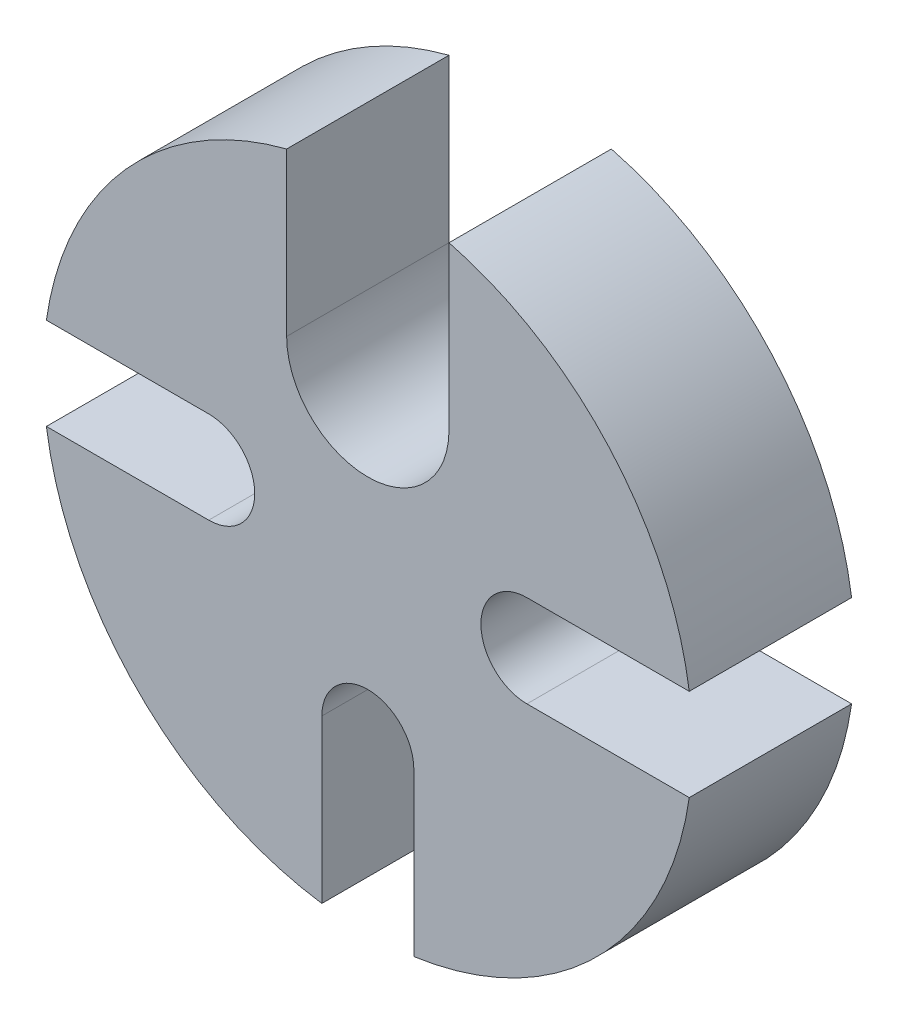
ISO-10303-21;
HEADER;
FILE_DESCRIPTION(('STEP AP214'),'2;1');
FILE_NAME('part.step','',(''),(''),'','','');
FILE_SCHEMA(('AUTOMOTIVE_DESIGN { 1 0 10303 214 1 1 1 1 }'));
ENDSEC;
DATA;
#1=APPLICATION_CONTEXT('core data for automotive mechanical design processes');
#2=APPLICATION_PROTOCOL_DEFINITION('international standard','automotive_design',2000,#1);
#3=PRODUCT_CONTEXT('',#1,'mechanical');
#4=PRODUCT('Part','Part','',(#3));
#5=PRODUCT_RELATED_PRODUCT_CATEGORY('part','',(#4));
#6=PRODUCT_DEFINITION_FORMATION('','',#4);
#7=PRODUCT_DEFINITION_CONTEXT('part definition',#1,'design');
#8=PRODUCT_DEFINITION('design','',#6,#7);
#9=PRODUCT_DEFINITION_SHAPE('','',#8);
#10=(LENGTH_UNIT() NAMED_UNIT(*) SI_UNIT(.MILLI.,.METRE.));
#11=(NAMED_UNIT(*) PLANE_ANGLE_UNIT() SI_UNIT($,.RADIAN.));
#12=(NAMED_UNIT(*) SI_UNIT($,.STERADIAN.) SOLID_ANGLE_UNIT());
#13=UNCERTAINTY_MEASURE_WITH_UNIT(LENGTH_MEASURE(1.E-05),#10,'distance_accuracy_value','');
#14=(GEOMETRIC_REPRESENTATION_CONTEXT(3) GLOBAL_UNCERTAINTY_ASSIGNED_CONTEXT((#13)) GLOBAL_UNIT_ASSIGNED_CONTEXT((#10,
#11,#12)) REPRESENTATION_CONTEXT('',''));
#15=CARTESIAN_POINT('',(0.,0.,0.));
#16=DIRECTION('',(0.,0.,1.));
#17=DIRECTION('',(1.,0.,0.));
#18=AXIS2_PLACEMENT_3D('',#15,#16,#17);
#19=CARTESIAN_POINT('',(0.,0.,0.));
#20=DIRECTION('',(0.,0.,1.));
#21=DIRECTION('',(1.,0.,0.));
#22=AXIS2_PLACEMENT_3D('',#19,#20,#21);
#23=CYLINDRICAL_SURFACE('',#22,1524.);
#24=DIRECTION('',(0.,0.,-1.));
#25=VECTOR('',#24,1.);
#26=CARTESIAN_POINT('',(-1508.62957348668,-215.9,762.));
#27=LINE('',#26,#25);
#28=CARTESIAN_POINT('',(-1508.62957348668,-215.9,762.));
#29=VERTEX_POINT('',#28);
#30=CARTESIAN_POINT('',(-1508.62957348668,-215.9,0.));
#31=VERTEX_POINT('',#30);
#32=EDGE_CURVE('E196',#29,#31,#27,.T.);
#33=ORIENTED_EDGE('',*,*,#32,.T.);
#34=CARTESIAN_POINT('',(0.,0.,0.));
#35=DIRECTION('',(0.,0.,1.));
#36=DIRECTION('',(1.,0.,0.));
#37=AXIS2_PLACEMENT_3D('',#34,#35,#36);
#38=CIRCLE('',#37,1524.);
#39=CARTESIAN_POINT('',(-215.9,-1508.62957348668,0.));
#40=VERTEX_POINT('',#39);
#41=EDGE_CURVE('E180',#31,#40,#38,.T.);
#42=ORIENTED_EDGE('',*,*,#41,.T.);
#43=DIRECTION('',(0.,0.,-1.));
#44=VECTOR('',#43,1.);
#45=CARTESIAN_POINT('',(-215.9,-1508.62957348668,762.));
#46=LINE('',#45,#44);
#47=CARTESIAN_POINT('',(-215.9,-1508.62957348668,762.));
#48=VERTEX_POINT('',#47);
#49=EDGE_CURVE('E181',#48,#40,#46,.T.);
#50=ORIENTED_EDGE('',*,*,#49,.F.);
#51=CARTESIAN_POINT('',(0.,0.,762.));
#52=DIRECTION('',(0.,0.,1.));
#53=DIRECTION('',(1.,0.,0.));
#54=AXIS2_PLACEMENT_3D('',#51,#52,#53);
#55=CIRCLE('',#54,1524.);
#56=EDGE_CURVE('E173',#29,#48,#55,.T.);
#57=ORIENTED_EDGE('',*,*,#56,.F.);
#58=EDGE_LOOP('',(#33,#42,#50,#57));
#59=FACE_BOUND('',#58,.T.);
#60=ADVANCED_FACE('F34',(#59),#23,.T.);
#61=DIRECTION('',(0.,0.,-1.));
#62=VECTOR('',#61,1.);
#63=CARTESIAN_POINT('',(-1508.62957348668,215.9,762.));
#64=LINE('',#63,#62);
#65=CARTESIAN_POINT('',(-1508.62957348668,215.9,762.));
#66=VERTEX_POINT('',#65);
#67=CARTESIAN_POINT('',(-1508.62957348668,215.9,0.));
#68=VERTEX_POINT('',#67);
#69=EDGE_CURVE('E150',#66,#68,#64,.T.);
#70=ORIENTED_EDGE('',*,*,#69,.F.);
#71=CARTESIAN_POINT('',(-381.,1475.60665490458,762.));
#72=VERTEX_POINT('',#71);
#73=EDGE_CURVE('E162',#72,#66,#55,.T.);
#74=ORIENTED_EDGE('',*,*,#73,.F.);
#75=DIRECTION('',(0.,0.,-1.));
#76=VECTOR('',#75,1.);
#77=CARTESIAN_POINT('',(-381.,1475.60665490458,762.));
#78=LINE('',#77,#76);
#79=CARTESIAN_POINT('',(-381.,1475.60665490458,0.));
#80=VERTEX_POINT('',#79);
#81=EDGE_CURVE('E250',#72,#80,#78,.T.);
#82=ORIENTED_EDGE('',*,*,#81,.T.);
#83=EDGE_CURVE('E164',#80,#68,#38,.T.);
#84=ORIENTED_EDGE('',*,*,#83,.T.);
#85=EDGE_LOOP('',(#70,#74,#82,#84));
#86=FACE_BOUND('',#85,.T.);
#87=ADVANCED_FACE('F160',(#86),#23,.T.);
#88=DIRECTION('',(0.,0.,-1.));
#89=VECTOR('',#88,1.);
#90=CARTESIAN_POINT('',(381.,1475.60665490455,762.));
#91=LINE('',#90,#89);
#92=CARTESIAN_POINT('',(381.,1475.60665490455,762.));
#93=VERTEX_POINT('',#92);
#94=CARTESIAN_POINT('',(381.,1475.60665490455,0.));
#95=VERTEX_POINT('',#94);
#96=EDGE_CURVE('E258',#93,#95,#91,.T.);
#97=ORIENTED_EDGE('',*,*,#96,.F.);
#98=CARTESIAN_POINT('',(1508.62957348668,215.9,762.));
#99=VERTEX_POINT('',#98);
#100=EDGE_CURVE('E172',#99,#93,#55,.T.);
#101=ORIENTED_EDGE('',*,*,#100,.F.);
#102=DIRECTION('',(0.,0.,-1.));
#103=VECTOR('',#102,1.);
#104=CARTESIAN_POINT('',(1508.62957348668,215.9,762.));
#105=LINE('',#104,#103);
#106=CARTESIAN_POINT('',(1508.62957348668,215.9,0.));
#107=VERTEX_POINT('',#106);
#108=EDGE_CURVE('E215',#99,#107,#105,.T.);
#109=ORIENTED_EDGE('',*,*,#108,.T.);
#110=EDGE_CURVE('E184',#107,#95,#38,.T.);
#111=ORIENTED_EDGE('',*,*,#110,.T.);
#112=EDGE_LOOP('',(#97,#101,#109,#111));
#113=FACE_BOUND('',#112,.T.);
#114=ADVANCED_FACE('F312',(#113),#23,.T.);
#115=DIRECTION('',(0.,0.,-1.));
#116=VECTOR('',#115,1.);
#117=CARTESIAN_POINT('',(1508.62957348668,-215.9,762.));
#118=LINE('',#117,#116);
#119=CARTESIAN_POINT('',(1508.62957348668,-215.9,762.));
#120=VERTEX_POINT('',#119);
#121=CARTESIAN_POINT('',(1508.62957348668,-215.9,0.));
#122=VERTEX_POINT('',#121);
#123=EDGE_CURVE('E235',#120,#122,#118,.T.);
#124=ORIENTED_EDGE('',*,*,#123,.F.);
#125=CARTESIAN_POINT('',(215.9,-1508.62957348668,762.));
#126=VERTEX_POINT('',#125);
#127=EDGE_CURVE('E176',#126,#120,#55,.T.);
#128=ORIENTED_EDGE('',*,*,#127,.F.);
#129=DIRECTION('',(0.,0.,-1.));
#130=VECTOR('',#129,1.);
#131=CARTESIAN_POINT('',(215.9,-1508.62957348668,762.));
#132=LINE('',#131,#130);
#133=CARTESIAN_POINT('',(215.9,-1508.62957348668,0.));
#134=VERTEX_POINT('',#133);
#135=EDGE_CURVE('E177',#126,#134,#132,.T.);
#136=ORIENTED_EDGE('',*,*,#135,.T.);
#137=EDGE_CURVE('E42',#134,#122,#38,.T.);
#138=ORIENTED_EDGE('',*,*,#137,.T.);
#139=EDGE_LOOP('',(#124,#128,#136,#138));
#140=FACE_BOUND('',#139,.T.);
#141=ADVANCED_FACE('F36',(#140),#23,.T.);
#142=CARTESIAN_POINT('',(1524.,0.,0.));
#143=DIRECTION('',(0.,0.,-1.));
#144=DIRECTION('',(-1.,0.,0.));
#145=AXIS2_PLACEMENT_3D('',#142,#143,#144);
#146=PLANE('',#145);
#147=CARTESIAN_POINT('',(0.,0.,0.));
#148=DIRECTION('',(0.,0.,-1.));
#149=DIRECTION('',(-1.,0.,0.));
#150=AXIS2_PLACEMENT_3D('',#147,#148,#149);
#151=CIRCLE('',#150,50.8);
#152=CARTESIAN_POINT('',(-50.8,0.,0.));
#153=VERTEX_POINT('',#152);
#154=EDGE_CURVE('E11',#153,#153,#151,.T.);
#155=ORIENTED_EDGE('',*,*,#154,.F.);
#156=EDGE_LOOP('',(#155));
#157=FACE_BOUND('',#156,.T.);
#158=DIRECTION('',(-1.,0.,0.));
#159=VECTOR('',#158,1.);
#160=CARTESIAN_POINT('',(-746.75999999954,-215.9,0.));
#161=LINE('',#160,#159);
#162=CARTESIAN_POINT('',(-746.75999999954,-215.9,0.));
#163=VERTEX_POINT('',#162);
#164=EDGE_CURVE('E155',#163,#31,#161,.T.);
#165=ORIENTED_EDGE('',*,*,#164,.F.);
#166=CARTESIAN_POINT('',(-746.75999999954,0.,0.));
#167=DIRECTION('',(0.,0.,-1.));
#168=DIRECTION('',(-1.,0.,0.));
#169=AXIS2_PLACEMENT_3D('',#166,#167,#168);
#170=CIRCLE('',#169,215.9);
#171=CARTESIAN_POINT('',(-746.75999999954,215.9,0.));
#172=VERTEX_POINT('',#171);
#173=EDGE_CURVE('E283',#172,#163,#170,.T.);
#174=ORIENTED_EDGE('',*,*,#173,.F.);
#175=DIRECTION('',(1.,0.,0.));
#176=VECTOR('',#175,1.);
#177=CARTESIAN_POINT('',(-1508.62957348668,215.9,0.));
#178=LINE('',#177,#176);
#179=EDGE_CURVE('E286',#68,#172,#178,.T.);
#180=ORIENTED_EDGE('',*,*,#179,.F.);
#181=ORIENTED_EDGE('',*,*,#83,.F.);
#182=DIRECTION('',(0.,1.,0.));
#183=VECTOR('',#182,1.);
#184=CARTESIAN_POINT('',(-381.,713.739999999095,0.));
#185=LINE('',#184,#183);
#186=CARTESIAN_POINT('',(-381.,713.739999999095,0.));
#187=VERTEX_POINT('',#186);
#188=EDGE_CURVE('E265',#187,#80,#185,.T.);
#189=ORIENTED_EDGE('',*,*,#188,.F.);
#190=CARTESIAN_POINT('',(-1.11022302462516E-13,713.739999999095,0.));
#191=DIRECTION('',(0.,0.,-1.));
#192=DIRECTION('',(-1.,0.,0.));
#193=AXIS2_PLACEMENT_3D('',#190,#191,#192);
#194=CIRCLE('',#193,381.);
#195=CARTESIAN_POINT('',(381.,713.739999999095,0.));
#196=VERTEX_POINT('',#195);
#197=EDGE_CURVE('E268',#196,#187,#194,.T.);
#198=ORIENTED_EDGE('',*,*,#197,.F.);
#199=DIRECTION('',(0.,-1.,0.));
#200=VECTOR('',#199,1.);
#201=CARTESIAN_POINT('',(381.,1475.60665490455,0.));
#202=LINE('',#201,#200);
#203=EDGE_CURVE('E271',#95,#196,#202,.T.);
#204=ORIENTED_EDGE('',*,*,#203,.F.);
#205=ORIENTED_EDGE('',*,*,#110,.F.);
#206=DIRECTION('',(1.,0.,0.));
#207=VECTOR('',#206,1.);
#208=CARTESIAN_POINT('',(746.75999999954,215.9,0.));
#209=LINE('',#208,#207);
#210=CARTESIAN_POINT('',(746.75999999954,215.9,0.));
#211=VERTEX_POINT('',#210);
#212=EDGE_CURVE('E241',#211,#107,#209,.T.);
#213=ORIENTED_EDGE('',*,*,#212,.F.);
#214=CARTESIAN_POINT('',(746.75999999954,0.,0.));
#215=DIRECTION('',(0.,0.,-1.));
#216=DIRECTION('',(-1.,0.,0.));
#217=AXIS2_PLACEMENT_3D('',#214,#215,#216);
#218=CIRCLE('',#217,215.9);
#219=CARTESIAN_POINT('',(746.75999999954,-215.9,0.));
#220=VERTEX_POINT('',#219);
#221=EDGE_CURVE('E244',#220,#211,#218,.T.);
#222=ORIENTED_EDGE('',*,*,#221,.F.);
#223=DIRECTION('',(-1.,0.,0.));
#224=VECTOR('',#223,1.);
#225=CARTESIAN_POINT('',(1508.62957348668,-215.9,0.));
#226=LINE('',#225,#224);
#227=EDGE_CURVE('E247',#122,#220,#226,.T.);
#228=ORIENTED_EDGE('',*,*,#227,.F.);
#229=ORIENTED_EDGE('',*,*,#137,.F.);
#230=DIRECTION('',(0.,-1.,0.));
#231=VECTOR('',#230,1.);
#232=CARTESIAN_POINT('',(215.9,-746.75999999954,0.));
#233=LINE('',#232,#231);
#234=CARTESIAN_POINT('',(215.9,-746.75999999954,0.));
#235=VERTEX_POINT('',#234);
#236=EDGE_CURVE('E217',#235,#134,#233,.T.);
#237=ORIENTED_EDGE('',*,*,#236,.F.);
#238=CARTESIAN_POINT('',(0.,-746.75999999954,0.));
#239=DIRECTION('',(0.,0.,-1.));
#240=DIRECTION('',(-1.,0.,0.));
#241=AXIS2_PLACEMENT_3D('',#238,#239,#240);
#242=CIRCLE('',#241,215.9);
#243=CARTESIAN_POINT('',(-215.9,-746.75999999954,0.));
#244=VERTEX_POINT('',#243);
#245=EDGE_CURVE('E214',#244,#235,#242,.T.);
#246=ORIENTED_EDGE('',*,*,#245,.F.);
#247=DIRECTION('',(0.,1.,0.));
#248=VECTOR('',#247,1.);
#249=CARTESIAN_POINT('',(-215.9,-1508.62957348668,0.));
#250=LINE('',#249,#248);
#251=EDGE_CURVE('E205',#40,#244,#250,.T.);
#252=ORIENTED_EDGE('',*,*,#251,.F.);
#253=ORIENTED_EDGE('',*,*,#41,.F.);
#254=EDGE_LOOP('',(#165,#174,#180,#181,#189,#198,#204,#205,#213,#222,#228,#229,#237,#246,#252,#253));
#255=FACE_BOUND('',#254,.T.);
#256=ADVANCED_FACE('F211',(#157,#255),#146,.T.);
#257=CARTESIAN_POINT('',(0.,0.,762.));
#258=DIRECTION('',(0.,0.,1.));
#259=DIRECTION('',(1.,0.,0.));
#260=AXIS2_PLACEMENT_3D('',#257,#258,#259);
#261=PLANE('',#260);
#262=DIRECTION('',(-1.,0.,0.));
#263=VECTOR('',#262,1.);
#264=CARTESIAN_POINT('',(-746.75999999954,-215.9,762.));
#265=LINE('',#264,#263);
#266=CARTESIAN_POINT('',(-746.75999999954,-215.9,762.));
#267=VERTEX_POINT('',#266);
#268=EDGE_CURVE('E165',#267,#29,#265,.T.);
#269=ORIENTED_EDGE('',*,*,#268,.T.);
#270=ORIENTED_EDGE('',*,*,#56,.T.);
#271=DIRECTION('',(0.,1.,0.));
#272=VECTOR('',#271,1.);
#273=CARTESIAN_POINT('',(-215.9,-1508.62957348668,762.));
#274=LINE('',#273,#272);
#275=CARTESIAN_POINT('',(-215.9,-746.75999999954,762.));
#276=VERTEX_POINT('',#275);
#277=EDGE_CURVE('E208',#48,#276,#274,.T.);
#278=ORIENTED_EDGE('',*,*,#277,.T.);
#279=CARTESIAN_POINT('',(0.,-746.75999999954,762.));
#280=DIRECTION('',(0.,0.,-1.));
#281=DIRECTION('',(-1.,0.,0.));
#282=AXIS2_PLACEMENT_3D('',#279,#280,#281);
#283=CIRCLE('',#282,215.9);
#284=CARTESIAN_POINT('',(215.9,-746.75999999954,762.));
#285=VERTEX_POINT('',#284);
#286=EDGE_CURVE('E231',#276,#285,#283,.T.);
#287=ORIENTED_EDGE('',*,*,#286,.T.);
#288=DIRECTION('',(0.,-1.,0.));
#289=VECTOR('',#288,1.);
#290=CARTESIAN_POINT('',(215.9,-746.75999999954,762.));
#291=LINE('',#290,#289);
#292=EDGE_CURVE('E210',#285,#126,#291,.T.);
#293=ORIENTED_EDGE('',*,*,#292,.T.);
#294=ORIENTED_EDGE('',*,*,#127,.T.);
#295=DIRECTION('',(-1.,0.,0.));
#296=VECTOR('',#295,1.);
#297=CARTESIAN_POINT('',(1508.62957348668,-215.9,762.));
#298=LINE('',#297,#296);
#299=CARTESIAN_POINT('',(746.75999999954,-215.9,762.));
#300=VERTEX_POINT('',#299);
#301=EDGE_CURVE('E243',#120,#300,#298,.T.);
#302=ORIENTED_EDGE('',*,*,#301,.T.);
#303=CARTESIAN_POINT('',(746.75999999954,0.,762.));
#304=DIRECTION('',(0.,0.,-1.));
#305=DIRECTION('',(-1.,0.,0.));
#306=AXIS2_PLACEMENT_3D('',#303,#304,#305);
#307=CIRCLE('',#306,215.9);
#308=CARTESIAN_POINT('',(746.75999999954,215.9,762.));
#309=VERTEX_POINT('',#308);
#310=EDGE_CURVE('E253',#300,#309,#307,.T.);
#311=ORIENTED_EDGE('',*,*,#310,.T.);
#312=DIRECTION('',(1.,0.,0.));
#313=VECTOR('',#312,1.);
#314=CARTESIAN_POINT('',(746.75999999954,215.9,762.));
#315=LINE('',#314,#313);
#316=EDGE_CURVE('E238',#309,#99,#315,.T.);
#317=ORIENTED_EDGE('',*,*,#316,.T.);
#318=ORIENTED_EDGE('',*,*,#100,.T.);
#319=DIRECTION('',(0.,-1.,0.));
#320=VECTOR('',#319,1.);
#321=CARTESIAN_POINT('',(381.,1475.60665490455,762.));
#322=LINE('',#321,#320);
#323=CARTESIAN_POINT('',(381.,713.739999999095,762.));
#324=VERTEX_POINT('',#323);
#325=EDGE_CURVE('E267',#93,#324,#322,.T.);
#326=ORIENTED_EDGE('',*,*,#325,.T.);
#327=CARTESIAN_POINT('',(-1.11022302462516E-13,713.739999999095,762.));
#328=DIRECTION('',(0.,0.,-1.));
#329=DIRECTION('',(-1.,0.,0.));
#330=AXIS2_PLACEMENT_3D('',#327,#328,#329);
#331=CIRCLE('',#330,381.);
#332=CARTESIAN_POINT('',(-381.,713.739999999095,762.));
#333=VERTEX_POINT('',#332);
#334=EDGE_CURVE('E57',#324,#333,#331,.T.);
#335=ORIENTED_EDGE('',*,*,#334,.T.);
#336=DIRECTION('',(0.,1.,0.));
#337=VECTOR('',#336,1.);
#338=CARTESIAN_POINT('',(-381.,713.739999999095,762.));
#339=LINE('',#338,#337);
#340=EDGE_CURVE('E171',#333,#72,#339,.T.);
#341=ORIENTED_EDGE('',*,*,#340,.T.);
#342=ORIENTED_EDGE('',*,*,#73,.T.);
#343=DIRECTION('',(1.,0.,0.));
#344=VECTOR('',#343,1.);
#345=CARTESIAN_POINT('',(-1508.62957348668,215.9,762.));
#346=LINE('',#345,#344);
#347=CARTESIAN_POINT('',(-746.75999999954,215.9,762.));
#348=VERTEX_POINT('',#347);
#349=EDGE_CURVE('E146',#66,#348,#346,.T.);
#350=ORIENTED_EDGE('',*,*,#349,.T.);
#351=CARTESIAN_POINT('',(-746.75999999954,0.,762.));
#352=DIRECTION('',(0.,0.,-1.));
#353=DIRECTION('',(-1.,0.,0.));
#354=AXIS2_PLACEMENT_3D('',#351,#352,#353);
#355=CIRCLE('',#354,215.9);
#356=EDGE_CURVE('E49',#348,#267,#355,.T.);
#357=ORIENTED_EDGE('',*,*,#356,.T.);
#358=EDGE_LOOP('',(#269,#270,#278,#287,#293,#294,#302,#311,#317,#318,#326,#335,#341,#342,#350,#357));
#359=FACE_BOUND('',#358,.T.);
#360=ADVANCED_FACE('F169',(#359),#261,.T.);
#361=CARTESIAN_POINT('',(215.9,-746.75999999954,762.));
#362=DIRECTION('',(1.,0.,0.));
#363=DIRECTION('',(0.,1.,0.));
#364=AXIS2_PLACEMENT_3D('',#361,#362,#363);
#365=PLANE('',#364);
#366=ORIENTED_EDGE('',*,*,#236,.T.);
#367=ORIENTED_EDGE('',*,*,#135,.F.);
#368=ORIENTED_EDGE('',*,*,#292,.F.);
#369=DIRECTION('',(0.,0.,-1.));
#370=VECTOR('',#369,1.);
#371=CARTESIAN_POINT('',(215.9,-746.75999999954,762.));
#372=LINE('',#371,#370);
#373=EDGE_CURVE('E227',#285,#235,#372,.T.);
#374=ORIENTED_EDGE('',*,*,#373,.T.);
#375=EDGE_LOOP('',(#366,#367,#368,#374));
#376=FACE_BOUND('',#375,.T.);
#377=ADVANCED_FACE('F325',(#376),#365,.F.);
#378=CARTESIAN_POINT('',(0.,-746.75999999954,762.));
#379=DIRECTION('',(0.,0.,-1.));
#380=DIRECTION('',(-1.,0.,0.));
#381=AXIS2_PLACEMENT_3D('',#378,#379,#380);
#382=CYLINDRICAL_SURFACE('',#381,215.9);
#383=ORIENTED_EDGE('',*,*,#245,.T.);
#384=ORIENTED_EDGE('',*,*,#373,.F.);
#385=ORIENTED_EDGE('',*,*,#286,.F.);
#386=DIRECTION('',(0.,0.,-1.));
#387=VECTOR('',#386,1.);
#388=CARTESIAN_POINT('',(-215.9,-746.75999999954,762.));
#389=LINE('',#388,#387);
#390=EDGE_CURVE('E209',#276,#244,#389,.T.);
#391=ORIENTED_EDGE('',*,*,#390,.T.);
#392=EDGE_LOOP('',(#383,#384,#385,#391));
#393=FACE_BOUND('',#392,.T.);
#394=ADVANCED_FACE('F229',(#393),#382,.F.);
#395=CARTESIAN_POINT('',(-215.9,-1508.62957348668,762.));
#396=DIRECTION('',(-1.,0.,0.));
#397=DIRECTION('',(0.,-1.,0.));
#398=AXIS2_PLACEMENT_3D('',#395,#396,#397);
#399=PLANE('',#398);
#400=ORIENTED_EDGE('',*,*,#251,.T.);
#401=ORIENTED_EDGE('',*,*,#390,.F.);
#402=ORIENTED_EDGE('',*,*,#277,.F.);
#403=ORIENTED_EDGE('',*,*,#49,.T.);
#404=EDGE_LOOP('',(#400,#401,#402,#403));
#405=FACE_BOUND('',#404,.T.);
#406=ADVANCED_FACE('F203',(#405),#399,.F.);
#407=CARTESIAN_POINT('',(746.75999999954,215.9,762.));
#408=DIRECTION('',(0.,1.,0.));
#409=DIRECTION('',(0.,0.,1.));
#410=AXIS2_PLACEMENT_3D('',#407,#408,#409);
#411=PLANE('',#410);
#412=ORIENTED_EDGE('',*,*,#212,.T.);
#413=ORIENTED_EDGE('',*,*,#108,.F.);
#414=ORIENTED_EDGE('',*,*,#316,.F.);
#415=DIRECTION('',(0.,0.,-1.));
#416=VECTOR('',#415,1.);
#417=CARTESIAN_POINT('',(746.75999999954,215.9,762.));
#418=LINE('',#417,#416);
#419=EDGE_CURVE('E220',#309,#211,#418,.T.);
#420=ORIENTED_EDGE('',*,*,#419,.T.);
#421=EDGE_LOOP('',(#412,#413,#414,#420));
#422=FACE_BOUND('',#421,.T.);
#423=ADVANCED_FACE('F361',(#422),#411,.F.);
#424=CARTESIAN_POINT('',(746.75999999954,0.,762.));
#425=DIRECTION('',(0.,0.,-1.));
#426=DIRECTION('',(-1.,0.,0.));
#427=AXIS2_PLACEMENT_3D('',#424,#425,#426);
#428=CYLINDRICAL_SURFACE('',#427,215.9);
#429=ORIENTED_EDGE('',*,*,#221,.T.);
#430=ORIENTED_EDGE('',*,*,#419,.F.);
#431=ORIENTED_EDGE('',*,*,#310,.F.);
#432=DIRECTION('',(0.,0.,-1.));
#433=VECTOR('',#432,1.);
#434=CARTESIAN_POINT('',(746.75999999954,-215.9,762.));
#435=LINE('',#434,#433);
#436=EDGE_CURVE('E237',#300,#220,#435,.T.);
#437=ORIENTED_EDGE('',*,*,#436,.T.);
#438=EDGE_LOOP('',(#429,#430,#431,#437));
#439=FACE_BOUND('',#438,.T.);
#440=ADVANCED_FACE('F331',(#439),#428,.F.);
#441=CARTESIAN_POINT('',(1508.62957348668,-215.9,762.));
#442=DIRECTION('',(0.,-1.,0.));
#443=DIRECTION('',(0.,0.,-1.));
#444=AXIS2_PLACEMENT_3D('',#441,#442,#443);
#445=PLANE('',#444);
#446=ORIENTED_EDGE('',*,*,#227,.T.);
#447=ORIENTED_EDGE('',*,*,#436,.F.);
#448=ORIENTED_EDGE('',*,*,#301,.F.);
#449=ORIENTED_EDGE('',*,*,#123,.T.);
#450=EDGE_LOOP('',(#446,#447,#448,#449));
#451=FACE_BOUND('',#450,.T.);
#452=ADVANCED_FACE('F329',(#451),#445,.F.);
#453=CARTESIAN_POINT('',(-381.,713.739999999095,762.));
#454=DIRECTION('',(-1.,0.,0.));
#455=DIRECTION('',(0.,-1.,0.));
#456=AXIS2_PLACEMENT_3D('',#453,#454,#455);
#457=PLANE('',#456);
#458=ORIENTED_EDGE('',*,*,#188,.T.);
#459=ORIENTED_EDGE('',*,*,#81,.F.);
#460=ORIENTED_EDGE('',*,*,#340,.F.);
#461=DIRECTION('',(0.,0.,-1.));
#462=VECTOR('',#461,1.);
#463=CARTESIAN_POINT('',(-381.,713.739999999095,762.));
#464=LINE('',#463,#462);
#465=EDGE_CURVE('E262',#333,#187,#464,.T.);
#466=ORIENTED_EDGE('',*,*,#465,.T.);
#467=EDGE_LOOP('',(#458,#459,#460,#466));
#468=FACE_BOUND('',#467,.T.);
#469=ADVANCED_FACE('F344',(#468),#457,.F.);
#470=CARTESIAN_POINT('',(-1.11022302462516E-13,713.739999999095,762.));
#471=DIRECTION('',(0.,0.,-1.));
#472=DIRECTION('',(-1.,0.,0.));
#473=AXIS2_PLACEMENT_3D('',#470,#471,#472);
#474=CYLINDRICAL_SURFACE('',#473,381.);
#475=ORIENTED_EDGE('',*,*,#197,.T.);
#476=ORIENTED_EDGE('',*,*,#465,.F.);
#477=ORIENTED_EDGE('',*,*,#334,.F.);
#478=DIRECTION('',(0.,0.,-1.));
#479=VECTOR('',#478,1.);
#480=CARTESIAN_POINT('',(381.,713.739999999095,762.));
#481=LINE('',#480,#479);
#482=EDGE_CURVE('E260',#324,#196,#481,.T.);
#483=ORIENTED_EDGE('',*,*,#482,.T.);
#484=EDGE_LOOP('',(#475,#476,#477,#483));
#485=FACE_BOUND('',#484,.T.);
#486=ADVANCED_FACE('F342',(#485),#474,.F.);
#487=CARTESIAN_POINT('',(381.,1475.60665490455,762.));
#488=DIRECTION('',(1.,0.,0.));
#489=DIRECTION('',(0.,1.,0.));
#490=AXIS2_PLACEMENT_3D('',#487,#488,#489);
#491=PLANE('',#490);
#492=ORIENTED_EDGE('',*,*,#203,.T.);
#493=ORIENTED_EDGE('',*,*,#482,.F.);
#494=ORIENTED_EDGE('',*,*,#325,.F.);
#495=ORIENTED_EDGE('',*,*,#96,.T.);
#496=EDGE_LOOP('',(#492,#493,#494,#495));
#497=FACE_BOUND('',#496,.T.);
#498=ADVANCED_FACE('F339',(#497),#491,.F.);
#499=CARTESIAN_POINT('',(-746.75999999954,-215.9,762.));
#500=DIRECTION('',(0.,-1.,0.));
#501=DIRECTION('',(1.,0.,0.));
#502=AXIS2_PLACEMENT_3D('',#499,#500,#501);
#503=PLANE('',#502);
#504=ORIENTED_EDGE('',*,*,#164,.T.);
#505=ORIENTED_EDGE('',*,*,#32,.F.);
#506=ORIENTED_EDGE('',*,*,#268,.F.);
#507=DIRECTION('',(0.,0.,-1.));
#508=VECTOR('',#507,1.);
#509=CARTESIAN_POINT('',(-746.75999999954,-215.9,762.));
#510=LINE('',#509,#508);
#511=EDGE_CURVE('E279',#267,#163,#510,.T.);
#512=ORIENTED_EDGE('',*,*,#511,.T.);
#513=EDGE_LOOP('',(#504,#505,#506,#512));
#514=FACE_BOUND('',#513,.T.);
#515=ADVANCED_FACE('F348',(#514),#503,.F.);
#516=CARTESIAN_POINT('',(-746.75999999954,0.,762.));
#517=DIRECTION('',(0.,0.,-1.));
#518=DIRECTION('',(-1.,0.,0.));
#519=AXIS2_PLACEMENT_3D('',#516,#517,#518);
#520=CYLINDRICAL_SURFACE('',#519,215.9);
#521=ORIENTED_EDGE('',*,*,#173,.T.);
#522=ORIENTED_EDGE('',*,*,#511,.F.);
#523=ORIENTED_EDGE('',*,*,#356,.F.);
#524=DIRECTION('',(0.,0.,-1.));
#525=VECTOR('',#524,1.);
#526=CARTESIAN_POINT('',(-746.75999999954,215.9,762.));
#527=LINE('',#526,#525);
#528=EDGE_CURVE('E152',#348,#172,#527,.T.);
#529=ORIENTED_EDGE('',*,*,#528,.T.);
#530=EDGE_LOOP('',(#521,#522,#523,#529));
#531=FACE_BOUND('',#530,.T.);
#532=ADVANCED_FACE('F305',(#531),#520,.F.);
#533=CARTESIAN_POINT('',(-1508.62957348668,215.9,762.));
#534=DIRECTION('',(0.,1.,0.));
#535=DIRECTION('',(-1.,0.,0.));
#536=AXIS2_PLACEMENT_3D('',#533,#534,#535);
#537=PLANE('',#536);
#538=ORIENTED_EDGE('',*,*,#179,.T.);
#539=ORIENTED_EDGE('',*,*,#528,.F.);
#540=ORIENTED_EDGE('',*,*,#349,.F.);
#541=ORIENTED_EDGE('',*,*,#69,.T.);
#542=EDGE_LOOP('',(#538,#539,#540,#541));
#543=FACE_BOUND('',#542,.T.);
#544=ADVANCED_FACE('F149',(#543),#537,.F.);
#545=CARTESIAN_POINT('',(0.,0.,0.));
#546=DIRECTION('',(0.,0.,-1.));
#547=DIRECTION('',(-1.,0.,0.));
#548=AXIS2_PLACEMENT_3D('',#545,#546,#547);
#549=CYLINDRICAL_SURFACE('',#548,50.8);
#550=ORIENTED_EDGE('',*,*,#154,.T.);
#551=EDGE_LOOP('',(#550));
#552=FACE_BOUND('',#551,.T.);
#553=CARTESIAN_POINT('',(0.,0.,-762.));
#554=DIRECTION('',(0.,0.,-1.));
#555=DIRECTION('',(-1.,0.,0.));
#556=AXIS2_PLACEMENT_3D('',#553,#554,#555);
#557=CIRCLE('',#556,50.8);
#558=CARTESIAN_POINT('',(-50.8,0.,-762.));
#559=VERTEX_POINT('',#558);
#560=EDGE_CURVE('E288',#559,#559,#557,.T.);
#561=ORIENTED_EDGE('',*,*,#560,.F.);
#562=EDGE_LOOP('',(#561));
#563=FACE_BOUND('',#562,.T.);
#564=ADVANCED_FACE('F296',(#552,#563),#549,.T.);
#565=CARTESIAN_POINT('',(0.,0.,-762.));
#566=DIRECTION('',(0.,0.,-1.));
#567=DIRECTION('',(-1.,0.,0.));
#568=AXIS2_PLACEMENT_3D('',#565,#566,#567);
#569=PLANE('',#568);
#570=ORIENTED_EDGE('',*,*,#560,.T.);
#571=EDGE_LOOP('',(#570));
#572=FACE_BOUND('',#571,.T.);
#573=ADVANCED_FACE('F294',(#572),#569,.T.);
#574=CLOSED_SHELL('',(#60,#87,#114,#141,#256,#360,#377,#394,#406,#423,#440,#452,#469,#486,#498,
#515,#532,#544,#564,#573));
#575=MANIFOLD_SOLID_BREP('B2',#574);
#576=ADVANCED_BREP_SHAPE_REPRESENTATION('',(#18,#575),#14);
#577=SHAPE_DEFINITION_REPRESENTATION(#9,#576);
ENDSEC;
END-ISO-10303-21;
